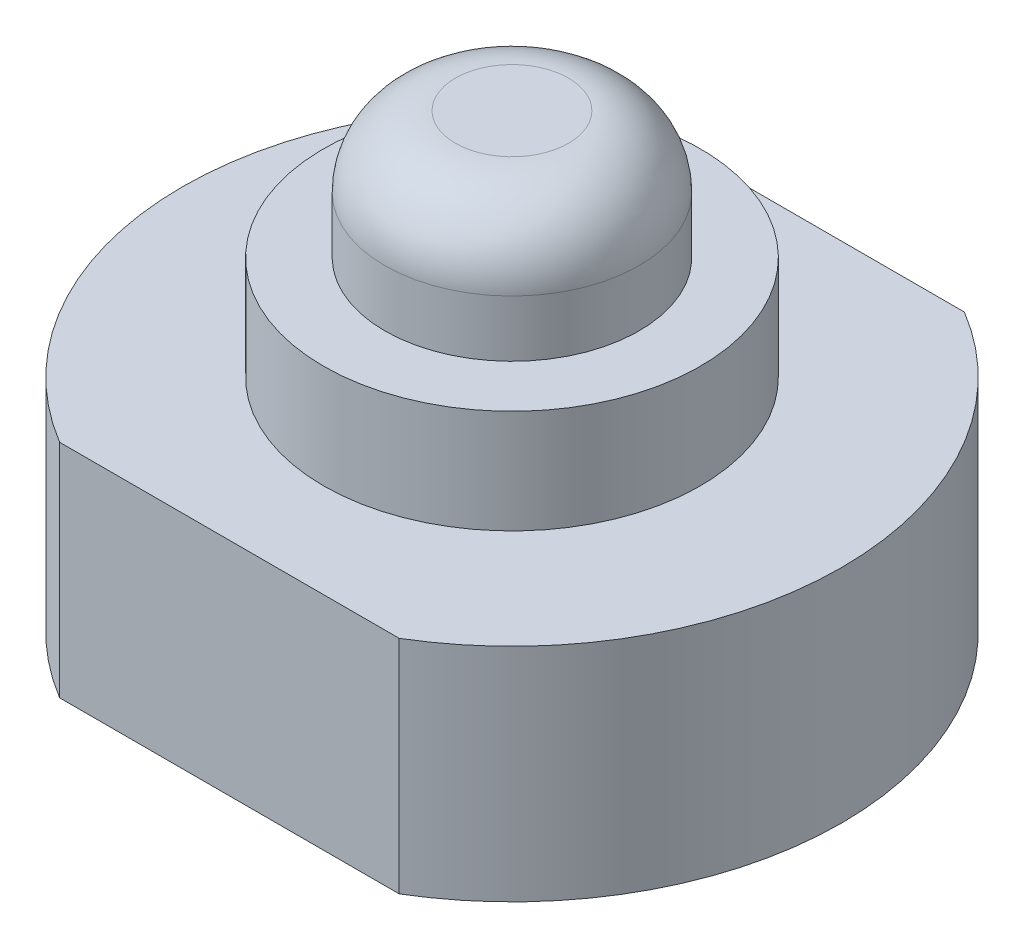
ISO-10303-21;
HEADER;
FILE_DESCRIPTION(('STEP AP214'),'2;1');
FILE_NAME('part.step','',(''),(''),'','','');
FILE_SCHEMA(('AUTOMOTIVE_DESIGN { 1 0 10303 214 1 1 1 1 }'));
ENDSEC;
DATA;
#1=APPLICATION_CONTEXT('core data for automotive mechanical design processes');
#2=APPLICATION_PROTOCOL_DEFINITION('international standard','automotive_design',2000,#1);
#3=PRODUCT_CONTEXT('',#1,'mechanical');
#4=PRODUCT('Part','Part','',(#3));
#5=PRODUCT_RELATED_PRODUCT_CATEGORY('part','',(#4));
#6=PRODUCT_DEFINITION_FORMATION('','',#4);
#7=PRODUCT_DEFINITION_CONTEXT('part definition',#1,'design');
#8=PRODUCT_DEFINITION('design','',#6,#7);
#9=PRODUCT_DEFINITION_SHAPE('','',#8);
#10=(LENGTH_UNIT() NAMED_UNIT(*) SI_UNIT(.MILLI.,.METRE.));
#11=(NAMED_UNIT(*) PLANE_ANGLE_UNIT() SI_UNIT($,.RADIAN.));
#12=(NAMED_UNIT(*) SI_UNIT($,.STERADIAN.) SOLID_ANGLE_UNIT());
#13=UNCERTAINTY_MEASURE_WITH_UNIT(LENGTH_MEASURE(1.E-05),#10,'distance_accuracy_value','');
#14=(GEOMETRIC_REPRESENTATION_CONTEXT(3) GLOBAL_UNCERTAINTY_ASSIGNED_CONTEXT((#13)) GLOBAL_UNIT_ASSIGNED_CONTEXT((#10,
#11,#12)) REPRESENTATION_CONTEXT('',''));
#15=CARTESIAN_POINT('',(0.,0.,0.));
#16=DIRECTION('',(0.,0.,1.));
#17=DIRECTION('',(1.,0.,0.));
#18=AXIS2_PLACEMENT_3D('',#15,#16,#17);
#19=CARTESIAN_POINT('',(0.,4.7,0.));
#20=DIRECTION('',(0.,-1.,0.));
#21=DIRECTION('',(0.,0.,-1.));
#22=AXIS2_PLACEMENT_3D('',#19,#20,#21);
#23=CYLINDRICAL_SURFACE('',#22,6.9994145802651);
#24=CARTESIAN_POINT('',(0.,0.,0.));
#25=DIRECTION('',(0.,1.,0.));
#26=DIRECTION('',(0.,0.,1.));
#27=AXIS2_PLACEMENT_3D('',#24,#25,#26);
#28=CIRCLE('',#27,6.9994145802651);
#29=CARTESIAN_POINT('',(-3.60441458026509,0.,-6.));
#30=VERTEX_POINT('',#29);
#31=CARTESIAN_POINT('',(-3.60441458026509,0.,6.));
#32=VERTEX_POINT('',#31);
#33=EDGE_CURVE('E111',#30,#32,#28,.T.);
#34=ORIENTED_EDGE('',*,*,#33,.T.);
#35=DIRECTION('',(0.,-1.,0.));
#36=VECTOR('',#35,1.);
#37=CARTESIAN_POINT('',(-3.60441458026509,4.7,6.));
#38=LINE('',#37,#36);
#39=CARTESIAN_POINT('',(-3.60441458026509,4.7,6.));
#40=VERTEX_POINT('',#39);
#41=EDGE_CURVE('E100',#40,#32,#38,.T.);
#42=ORIENTED_EDGE('',*,*,#41,.F.);
#43=CARTESIAN_POINT('',(0.,4.7,0.));
#44=DIRECTION('',(0.,1.,0.));
#45=DIRECTION('',(0.,0.,1.));
#46=AXIS2_PLACEMENT_3D('',#43,#44,#45);
#47=CIRCLE('',#46,6.9994145802651);
#48=CARTESIAN_POINT('',(-3.60441458026509,4.7,-6.));
#49=VERTEX_POINT('',#48);
#50=EDGE_CURVE('E92',#49,#40,#47,.T.);
#51=ORIENTED_EDGE('',*,*,#50,.F.);
#52=DIRECTION('',(0.,-1.,0.));
#53=VECTOR('',#52,1.);
#54=CARTESIAN_POINT('',(-3.60441458026509,4.7,-6.));
#55=LINE('',#54,#53);
#56=EDGE_CURVE('E107',#49,#30,#55,.T.);
#57=ORIENTED_EDGE('',*,*,#56,.T.);
#58=EDGE_LOOP('',(#34,#42,#51,#57));
#59=FACE_BOUND('',#58,.T.);
#60=ADVANCED_FACE('F38',(#59),#23,.T.);
#61=CARTESIAN_POINT('',(-3.60441458026509,4.7,6.));
#62=DIRECTION('',(0.,0.,-1.));
#63=DIRECTION('',(-1.,0.,0.));
#64=AXIS2_PLACEMENT_3D('',#61,#62,#63);
#65=PLANE('',#64);
#66=DIRECTION('',(1.,0.,0.));
#67=VECTOR('',#66,1.);
#68=CARTESIAN_POINT('',(-3.60441458026509,0.,6.));
#69=LINE('',#68,#67);
#70=CARTESIAN_POINT('',(3.60558541973491,0.,6.));
#71=VERTEX_POINT('',#70);
#72=EDGE_CURVE('E98',#32,#71,#69,.T.);
#73=ORIENTED_EDGE('',*,*,#72,.T.);
#74=DIRECTION('',(0.,-1.,0.));
#75=VECTOR('',#74,1.);
#76=CARTESIAN_POINT('',(3.60558541973491,4.7,6.));
#77=LINE('',#76,#75);
#78=CARTESIAN_POINT('',(3.60558541973491,4.7,6.));
#79=VERTEX_POINT('',#78);
#80=EDGE_CURVE('E96',#79,#71,#77,.T.);
#81=ORIENTED_EDGE('',*,*,#80,.F.);
#82=DIRECTION('',(1.,0.,0.));
#83=VECTOR('',#82,1.);
#84=CARTESIAN_POINT('',(-3.60441458026509,4.7,6.));
#85=LINE('',#84,#83);
#86=EDGE_CURVE('E87',#40,#79,#85,.T.);
#87=ORIENTED_EDGE('',*,*,#86,.F.);
#88=ORIENTED_EDGE('',*,*,#41,.T.);
#89=EDGE_LOOP('',(#73,#81,#87,#88));
#90=FACE_BOUND('',#89,.T.);
#91=ADVANCED_FACE('F97',(#90),#65,.F.);
#92=CARTESIAN_POINT('',(0.00117083946980665,4.7,0.));
#93=DIRECTION('',(0.,-1.,0.));
#94=DIRECTION('',(0.,0.,-1.));
#95=AXIS2_PLACEMENT_3D('',#92,#93,#94);
#96=CYLINDRICAL_SURFACE('',#95,6.9994145802651);
#97=CARTESIAN_POINT('',(0.00117083946980665,0.,0.));
#98=DIRECTION('',(0.,1.,0.));
#99=DIRECTION('',(0.,0.,-1.));
#100=AXIS2_PLACEMENT_3D('',#97,#98,#99);
#101=CIRCLE('',#100,6.9994145802651);
#102=CARTESIAN_POINT('',(3.60558541973491,0.,-6.));
#103=VERTEX_POINT('',#102);
#104=EDGE_CURVE('E73',#71,#103,#101,.T.);
#105=ORIENTED_EDGE('',*,*,#104,.T.);
#106=DIRECTION('',(0.,-1.,0.));
#107=VECTOR('',#106,1.);
#108=CARTESIAN_POINT('',(3.60558541973491,4.7,-6.));
#109=LINE('',#108,#107);
#110=CARTESIAN_POINT('',(3.60558541973491,4.7,-6.));
#111=VERTEX_POINT('',#110);
#112=EDGE_CURVE('E101',#111,#103,#109,.T.);
#113=ORIENTED_EDGE('',*,*,#112,.F.);
#114=CARTESIAN_POINT('',(0.00117083946980665,4.7,0.));
#115=DIRECTION('',(0.,1.,0.));
#116=DIRECTION('',(0.,0.,-1.));
#117=AXIS2_PLACEMENT_3D('',#114,#115,#116);
#118=CIRCLE('',#117,6.9994145802651);
#119=EDGE_CURVE('E90',#79,#111,#118,.T.);
#120=ORIENTED_EDGE('',*,*,#119,.F.);
#121=ORIENTED_EDGE('',*,*,#80,.T.);
#122=EDGE_LOOP('',(#105,#113,#120,#121));
#123=FACE_BOUND('',#122,.T.);
#124=ADVANCED_FACE('F103',(#123),#96,.T.);
#125=CARTESIAN_POINT('',(-3.60441458026509,4.7,-6.));
#126=DIRECTION('',(0.,0.,1.));
#127=DIRECTION('',(1.,0.,0.));
#128=AXIS2_PLACEMENT_3D('',#125,#126,#127);
#129=PLANE('',#128);
#130=DIRECTION('',(-1.,0.,0.));
#131=VECTOR('',#130,1.);
#132=CARTESIAN_POINT('',(-3.60441458026509,0.,-6.));
#133=LINE('',#132,#131);
#134=EDGE_CURVE('E79',#103,#30,#133,.T.);
#135=ORIENTED_EDGE('',*,*,#134,.T.);
#136=ORIENTED_EDGE('',*,*,#56,.F.);
#137=DIRECTION('',(-1.,0.,0.));
#138=VECTOR('',#137,1.);
#139=CARTESIAN_POINT('',(-3.60441458026509,4.7,-6.));
#140=LINE('',#139,#138);
#141=EDGE_CURVE('E56',#111,#49,#140,.T.);
#142=ORIENTED_EDGE('',*,*,#141,.F.);
#143=ORIENTED_EDGE('',*,*,#112,.T.);
#144=EDGE_LOOP('',(#135,#136,#142,#143));
#145=FACE_BOUND('',#144,.T.);
#146=ADVANCED_FACE('F157',(#145),#129,.F.);
#147=CARTESIAN_POINT('',(0.,4.7,0.));
#148=DIRECTION('',(0.,1.,0.));
#149=DIRECTION('',(0.,0.,1.));
#150=AXIS2_PLACEMENT_3D('',#147,#148,#149);
#151=PLANE('',#150);
#152=CARTESIAN_POINT('',(0.,4.7,0.));
#153=DIRECTION('',(0.,1.,0.));
#154=DIRECTION('',(0.,0.,1.));
#155=AXIS2_PLACEMENT_3D('',#152,#153,#154);
#156=CIRCLE('',#155,4.);
#157=CARTESIAN_POINT('',(0.,4.7,4.));
#158=VERTEX_POINT('',#157);
#159=EDGE_CURVE('E127',#158,#158,#156,.T.);
#160=ORIENTED_EDGE('',*,*,#159,.F.);
#161=EDGE_LOOP('',(#160));
#162=FACE_BOUND('',#161,.T.);
#163=ORIENTED_EDGE('',*,*,#50,.T.);
#164=ORIENTED_EDGE('',*,*,#86,.T.);
#165=ORIENTED_EDGE('',*,*,#119,.T.);
#166=ORIENTED_EDGE('',*,*,#141,.T.);
#167=EDGE_LOOP('',(#163,#164,#165,#166));
#168=FACE_BOUND('',#167,.T.);
#169=ADVANCED_FACE('F88',(#162,#168),#151,.T.);
#170=CARTESIAN_POINT('',(0.,0.,0.));
#171=DIRECTION('',(0.,1.,0.));
#172=DIRECTION('',(0.,0.,1.));
#173=AXIS2_PLACEMENT_3D('',#170,#171,#172);
#174=PLANE('',#173);
#175=ORIENTED_EDGE('',*,*,#33,.F.);
#176=ORIENTED_EDGE('',*,*,#134,.F.);
#177=ORIENTED_EDGE('',*,*,#104,.F.);
#178=ORIENTED_EDGE('',*,*,#72,.F.);
#179=EDGE_LOOP('',(#175,#176,#177,#178));
#180=FACE_BOUND('',#179,.T.);
#181=ADVANCED_FACE('F152',(#180),#174,.F.);
#182=CARTESIAN_POINT('',(0.,6.9,0.));
#183=DIRECTION('',(0.,-1.,0.));
#184=DIRECTION('',(0.,0.,-1.));
#185=AXIS2_PLACEMENT_3D('',#182,#183,#184);
#186=CYLINDRICAL_SURFACE('',#185,4.);
#187=CARTESIAN_POINT('',(0.,6.9,0.));
#188=DIRECTION('',(0.,1.,0.));
#189=DIRECTION('',(0.,0.,1.));
#190=AXIS2_PLACEMENT_3D('',#187,#188,#189);
#191=CIRCLE('',#190,4.);
#192=CARTESIAN_POINT('',(0.,6.9,4.));
#193=VERTEX_POINT('',#192);
#194=EDGE_CURVE('E115',#193,#193,#191,.T.);
#195=ORIENTED_EDGE('',*,*,#194,.F.);
#196=EDGE_LOOP('',(#195));
#197=FACE_BOUND('',#196,.T.);
#198=ORIENTED_EDGE('',*,*,#159,.T.);
#199=EDGE_LOOP('',(#198));
#200=FACE_BOUND('',#199,.T.);
#201=ADVANCED_FACE('F149',(#197,#200),#186,.T.);
#202=CARTESIAN_POINT('',(0.,6.9,0.));
#203=DIRECTION('',(0.,1.,0.));
#204=DIRECTION('',(0.,0.,1.));
#205=AXIS2_PLACEMENT_3D('',#202,#203,#204);
#206=PLANE('',#205);
#207=CARTESIAN_POINT('',(0.,6.9,0.));
#208=DIRECTION('',(0.,1.,0.));
#209=DIRECTION('',(0.,0.,1.));
#210=AXIS2_PLACEMENT_3D('',#207,#208,#209);
#211=CIRCLE('',#210,2.7);
#212=CARTESIAN_POINT('',(0.,6.9,2.7));
#213=VERTEX_POINT('',#212);
#214=EDGE_CURVE('E130',#213,#213,#211,.T.);
#215=ORIENTED_EDGE('',*,*,#214,.F.);
#216=EDGE_LOOP('',(#215));
#217=FACE_BOUND('',#216,.T.);
#218=ORIENTED_EDGE('',*,*,#194,.T.);
#219=EDGE_LOOP('',(#218));
#220=FACE_BOUND('',#219,.T.);
#221=ADVANCED_FACE('F147',(#217,#220),#206,.T.);
#222=CARTESIAN_POINT('',(0.,9.6,0.));
#223=DIRECTION('',(0.,-1.,0.));
#224=DIRECTION('',(0.,0.,-1.));
#225=AXIS2_PLACEMENT_3D('',#222,#223,#224);
#226=CYLINDRICAL_SURFACE('',#225,2.7);
#227=CARTESIAN_POINT('',(0.,8.1,0.));
#228=DIRECTION('',(0.,1.,0.));
#229=DIRECTION('',(0.,0.,1.));
#230=AXIS2_PLACEMENT_3D('',#227,#228,#229);
#231=CIRCLE('',#230,2.7);
#232=CARTESIAN_POINT('',(0.,8.1,2.7));
#233=VERTEX_POINT('',#232);
#234=EDGE_CURVE('E11',#233,#233,#231,.F.);
#235=ORIENTED_EDGE('',*,*,#234,.T.);
#236=EDGE_LOOP('',(#235));
#237=FACE_BOUND('',#236,.T.);
#238=ORIENTED_EDGE('',*,*,#214,.T.);
#239=EDGE_LOOP('',(#238));
#240=FACE_BOUND('',#239,.T.);
#241=ADVANCED_FACE('F207',(#237,#240),#226,.T.);
#242=CARTESIAN_POINT('',(0.,9.6,0.));
#243=DIRECTION('',(0.,1.,0.));
#244=DIRECTION('',(0.,0.,1.));
#245=AXIS2_PLACEMENT_3D('',#242,#243,#244);
#246=PLANE('',#245);
#247=CARTESIAN_POINT('',(0.,9.6,0.));
#248=DIRECTION('',(0.,1.,0.));
#249=DIRECTION('',(0.,0.,1.));
#250=AXIS2_PLACEMENT_3D('',#247,#248,#249);
#251=CIRCLE('',#250,1.2);
#252=CARTESIAN_POINT('',(0.,9.6,1.2));
#253=VERTEX_POINT('',#252);
#254=EDGE_CURVE('E48',#253,#253,#251,.T.);
#255=ORIENTED_EDGE('',*,*,#254,.T.);
#256=EDGE_LOOP('',(#255));
#257=FACE_BOUND('',#256,.T.);
#258=ADVANCED_FACE('F217',(#257),#246,.T.);
#259=CARTESIAN_POINT('',(0.,8.1,0.));
#260=DIRECTION('',(0.,1.,0.));
#261=DIRECTION('',(0.,0.,1.));
#262=AXIS2_PLACEMENT_3D('',#259,#260,#261);
#263=DEGENERATE_TOROIDAL_SURFACE('',#262,1.2,1.5,.T.);
#264=ORIENTED_EDGE('',*,*,#234,.F.);
#265=EDGE_LOOP('',(#264));
#266=FACE_BOUND('',#265,.T.);
#267=ORIENTED_EDGE('',*,*,#254,.F.);
#268=EDGE_LOOP('',(#267));
#269=FACE_BOUND('',#268,.T.);
#270=ADVANCED_FACE('F40',(#266,#269),#263,.T.);
#271=CLOSED_SHELL('',(#60,#91,#124,#146,#169,#181,#201,#221,#241,#258,#270));
#272=MANIFOLD_SOLID_BREP('B2',#271);
#273=ADVANCED_BREP_SHAPE_REPRESENTATION('',(#18,#272),#14);
#274=SHAPE_DEFINITION_REPRESENTATION(#9,#273);
ENDSEC;
END-ISO-10303-21;
